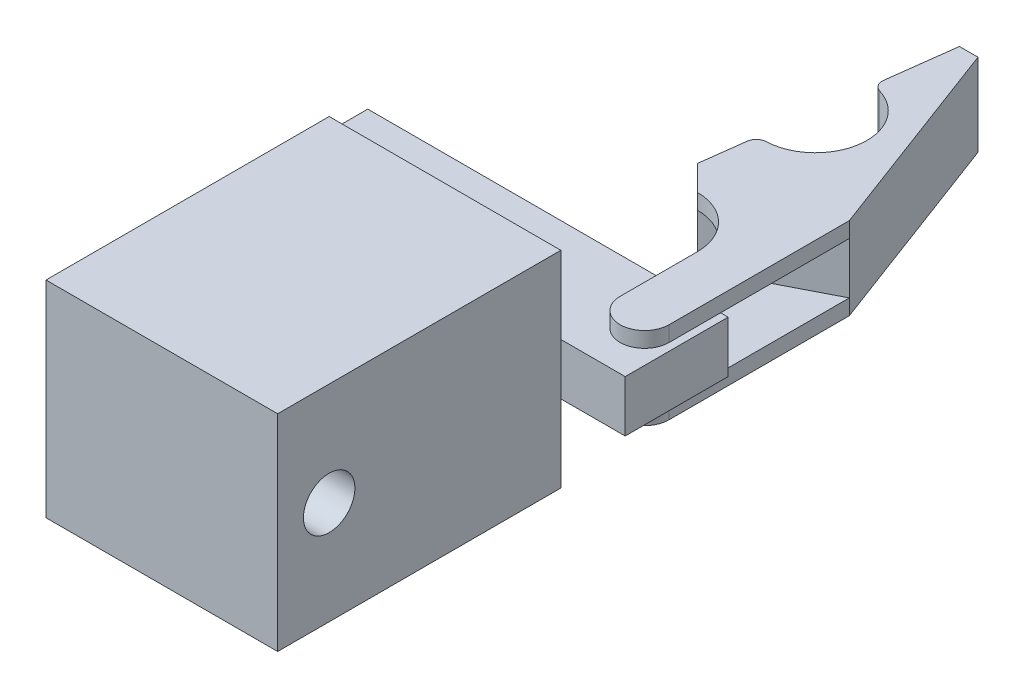
ISO-10303-21;
HEADER;
FILE_DESCRIPTION(('STEP AP214'),'2;1');
FILE_NAME('part.step','',(''),(''),'','','');
FILE_SCHEMA(('AUTOMOTIVE_DESIGN { 1 0 10303 214 1 1 1 1 }'));
ENDSEC;
DATA;
#1=APPLICATION_CONTEXT('core data for automotive mechanical design processes');
#2=APPLICATION_PROTOCOL_DEFINITION('international standard','automotive_design',2000,#1);
#3=PRODUCT_CONTEXT('',#1,'mechanical');
#4=PRODUCT('Part','Part','',(#3));
#5=PRODUCT_RELATED_PRODUCT_CATEGORY('part','',(#4));
#6=PRODUCT_DEFINITION_FORMATION('','',#4);
#7=PRODUCT_DEFINITION_CONTEXT('part definition',#1,'design');
#8=PRODUCT_DEFINITION('design','',#6,#7);
#9=PRODUCT_DEFINITION_SHAPE('','',#8);
#10=(LENGTH_UNIT() NAMED_UNIT(*) SI_UNIT(.MILLI.,.METRE.));
#11=(NAMED_UNIT(*) PLANE_ANGLE_UNIT() SI_UNIT($,.RADIAN.));
#12=(NAMED_UNIT(*) SI_UNIT($,.STERADIAN.) SOLID_ANGLE_UNIT());
#13=UNCERTAINTY_MEASURE_WITH_UNIT(LENGTH_MEASURE(1.E-05),#10,'distance_accuracy_value','');
#14=(GEOMETRIC_REPRESENTATION_CONTEXT(3) GLOBAL_UNCERTAINTY_ASSIGNED_CONTEXT((#13)) GLOBAL_UNIT_ASSIGNED_CONTEXT((#10,
#11,#12)) REPRESENTATION_CONTEXT('',''));
#15=CARTESIAN_POINT('',(0.,0.,0.));
#16=DIRECTION('',(0.,0.,1.));
#17=DIRECTION('',(1.,0.,0.));
#18=AXIS2_PLACEMENT_3D('',#15,#16,#17);
#19=CARTESIAN_POINT('',(15.2458291638118,25.,-99.1847945679448));
#20=DIRECTION('',(0.,1.,0.));
#21=DIRECTION('',(-1.,0.,0.));
#22=AXIS2_PLACEMENT_3D('',#19,#20,#21);
#23=PLANE('',#22);
#24=DIRECTION('',(-0.89005464278004,0.,0.455853850335495));
#25=VECTOR('',#24,1.);
#26=CARTESIAN_POINT('',(-22.4473482633456,25.,-43.8284474841817));
#27=LINE('',#26,#25);
#28=CARTESIAN_POINT('',(33.5338580237889,25.,-72.5));
#29=VERTEX_POINT('',#28);
#30=CARTESIAN_POINT('',(14.008858023789,25.,-62.4999999999999));
#31=VERTEX_POINT('',#30);
#32=EDGE_CURVE('E344',#29,#31,#27,.T.);
#33=ORIENTED_EDGE('',*,*,#32,.F.);
#34=DIRECTION('',(0.,0.,-1.));
#35=VECTOR('',#34,1.);
#36=CARTESIAN_POINT('',(33.5338580237892,25.,-37.5));
#37=LINE('',#36,#35);
#38=CARTESIAN_POINT('',(33.5338580237892,25.,-47.5));
#39=VERTEX_POINT('',#38);
#40=EDGE_CURVE('E406',#39,#29,#37,.T.);
#41=ORIENTED_EDGE('',*,*,#40,.F.);
#42=DIRECTION('',(-1.,0.,0.));
#43=VECTOR('',#42,1.);
#44=CARTESIAN_POINT('',(0.,25.,-47.5));
#45=LINE('',#44,#43);
#46=CARTESIAN_POINT('',(24.0088580237891,25.,-47.5));
#47=VERTEX_POINT('',#46);
#48=EDGE_CURVE('E451',#39,#47,#45,.T.);
#49=ORIENTED_EDGE('',*,*,#48,.T.);
#50=DIRECTION('',(0.,0.,1.));
#51=VECTOR('',#50,1.);
#52=CARTESIAN_POINT('',(24.0088580237891,25.,-52.5));
#53=LINE('',#52,#51);
#54=CARTESIAN_POINT('',(24.008858023789,25.,-52.5));
#55=VERTEX_POINT('',#54);
#56=EDGE_CURVE('E399',#55,#47,#53,.T.);
#57=ORIENTED_EDGE('',*,*,#56,.F.);
#58=CARTESIAN_POINT('',(14.008858023789,25.,-52.4999999999999));
#59=DIRECTION('',(0.,-1.,0.));
#60=DIRECTION('',(-1.,0.,0.));
#61=AXIS2_PLACEMENT_3D('',#58,#59,#60);
#62=CIRCLE('',#61,10.);
#63=EDGE_CURVE('E357',#31,#55,#62,.T.);
#64=ORIENTED_EDGE('',*,*,#63,.F.);
#65=EDGE_LOOP('',(#33,#41,#49,#57,#64));
#66=FACE_BOUND('',#65,.T.);
#67=ADVANCED_FACE('F42',(#66),#23,.F.);
#68=CARTESIAN_POINT('',(35.,25.,-47.5));
#69=DIRECTION('',(0.,-1.,0.));
#70=DIRECTION('',(1.,0.,0.));
#71=AXIS2_PLACEMENT_3D('',#68,#69,#70);
#72=PLANE('',#71);
#73=CARTESIAN_POINT('',(-27.7826566636179,25.,-37.5));
#74=DIRECTION('',(0.,1.,0.));
#75=DIRECTION('',(-1.,0.,0.));
#76=AXIS2_PLACEMENT_3D('',#73,#74,#75);
#77=CIRCLE('',#76,1.5);
#78=CARTESIAN_POINT('',(-29.2826566636179,25.,-37.5));
#79=VERTEX_POINT('',#78);
#80=EDGE_CURVE('E454',#79,#79,#77,.T.);
#81=ORIENTED_EDGE('',*,*,#80,.F.);
#82=EDGE_LOOP('',(#81));
#83=FACE_BOUND('',#82,.T.);
#84=CARTESIAN_POINT('',(24.0088580237892,25.,-37.5));
#85=VERTEX_POINT('',#84);
#86=EDGE_CURVE('E398',#47,#85,#53,.T.);
#87=ORIENTED_EDGE('',*,*,#86,.F.);
#88=DIRECTION('',(1.,0.,0.));
#89=VECTOR('',#88,1.);
#90=CARTESIAN_POINT('',(35.,25.,-47.5));
#91=LINE('',#90,#89);
#92=CARTESIAN_POINT('',(-35.,25.,-47.5));
#93=VERTEX_POINT('',#92);
#94=EDGE_CURVE('E468',#93,#47,#91,.T.);
#95=ORIENTED_EDGE('',*,*,#94,.F.);
#96=DIRECTION('',(0.,0.,1.));
#97=VECTOR('',#96,1.);
#98=CARTESIAN_POINT('',(-35.,25.,-47.5));
#99=LINE('',#98,#97);
#100=CARTESIAN_POINT('',(-35.,25.,-27.5));
#101=VERTEX_POINT('',#100);
#102=EDGE_CURVE('E505',#93,#101,#99,.T.);
#103=ORIENTED_EDGE('',*,*,#102,.T.);
#104=DIRECTION('',(1.,0.,0.));
#105=VECTOR('',#104,1.);
#106=CARTESIAN_POINT('',(35.,25.,-27.5));
#107=LINE('',#106,#105);
#108=CARTESIAN_POINT('',(-22.5,25.,-27.5));
#109=VERTEX_POINT('',#108);
#110=EDGE_CURVE('E485',#101,#109,#107,.T.);
#111=ORIENTED_EDGE('',*,*,#110,.T.);
#112=CARTESIAN_POINT('',(22.5,25.,-27.5));
#113=VERTEX_POINT('',#112);
#114=EDGE_CURVE('E53',#109,#113,#107,.T.);
#115=ORIENTED_EDGE('',*,*,#114,.T.);
#116=CARTESIAN_POINT('',(35.,25.,-27.5));
#117=VERTEX_POINT('',#116);
#118=EDGE_CURVE('E484',#113,#117,#107,.T.);
#119=ORIENTED_EDGE('',*,*,#118,.T.);
#120=DIRECTION('',(0.,0.,1.));
#121=VECTOR('',#120,1.);
#122=CARTESIAN_POINT('',(35.,25.,-47.5));
#123=LINE('',#122,#121);
#124=CARTESIAN_POINT('',(35.,25.,-47.5));
#125=VERTEX_POINT('',#124);
#126=EDGE_CURVE('E501',#125,#117,#123,.T.);
#127=ORIENTED_EDGE('',*,*,#126,.F.);
#128=EDGE_CURVE('E467',#39,#125,#91,.T.);
#129=ORIENTED_EDGE('',*,*,#128,.F.);
#130=CARTESIAN_POINT('',(33.5338580237892,25.,-37.5));
#131=VERTEX_POINT('',#130);
#132=EDGE_CURVE('E71',#131,#39,#37,.T.);
#133=ORIENTED_EDGE('',*,*,#132,.F.);
#134=CARTESIAN_POINT('',(28.7713580237892,25.,-37.5));
#135=DIRECTION('',(0.,1.,0.));
#136=DIRECTION('',(-1.,0.,0.));
#137=AXIS2_PLACEMENT_3D('',#134,#135,#136);
#138=CIRCLE('',#137,4.76250000000001);
#139=EDGE_CURVE('E403',#85,#131,#138,.T.);
#140=ORIENTED_EDGE('',*,*,#139,.F.);
#141=EDGE_LOOP('',(#87,#95,#103,#111,#115,#119,#127,#129,#133,#140));
#142=FACE_BOUND('',#141,.T.);
#143=ADVANCED_FACE('F598',(#83,#142),#72,.F.);
#144=CARTESIAN_POINT('',(-22.5,40.,-27.5));
#145=DIRECTION('',(0.,0.,1.));
#146=DIRECTION('',(1.,0.,0.));
#147=AXIS2_PLACEMENT_3D('',#144,#145,#146);
#148=PLANE('',#147);
#149=DIRECTION('',(-1.,0.,0.));
#150=VECTOR('',#149,1.);
#151=CARTESIAN_POINT('',(35.,15.,-27.5));
#152=LINE('',#151,#150);
#153=CARTESIAN_POINT('',(22.5,15.,-27.5));
#154=VERTEX_POINT('',#153);
#155=CARTESIAN_POINT('',(-22.5,15.,-27.5));
#156=VERTEX_POINT('',#155);
#157=EDGE_CURVE('E11',#154,#156,#152,.T.);
#158=ORIENTED_EDGE('',*,*,#157,.F.);
#159=DIRECTION('',(0.,-1.,0.));
#160=VECTOR('',#159,1.);
#161=CARTESIAN_POINT('',(22.5,40.,-27.5));
#162=LINE('',#161,#160);
#163=CARTESIAN_POINT('',(22.5,0.,-27.5));
#164=VERTEX_POINT('',#163);
#165=EDGE_CURVE('E555',#154,#164,#162,.T.);
#166=ORIENTED_EDGE('',*,*,#165,.T.);
#167=DIRECTION('',(-1.,0.,0.));
#168=VECTOR('',#167,1.);
#169=CARTESIAN_POINT('',(-22.5,0.,-27.5));
#170=LINE('',#169,#168);
#171=CARTESIAN_POINT('',(-22.5,0.,-27.5));
#172=VERTEX_POINT('',#171);
#173=EDGE_CURVE('E536',#164,#172,#170,.T.);
#174=ORIENTED_EDGE('',*,*,#173,.T.);
#175=DIRECTION('',(0.,-1.,0.));
#176=VECTOR('',#175,1.);
#177=CARTESIAN_POINT('',(-22.5,40.,-27.5));
#178=LINE('',#177,#176);
#179=EDGE_CURVE('E551',#156,#172,#178,.T.);
#180=ORIENTED_EDGE('',*,*,#179,.F.);
#181=EDGE_LOOP('',(#158,#166,#174,#180));
#182=FACE_BOUND('',#181,.T.);
#183=ADVANCED_FACE('F572',(#182),#148,.F.);
#184=ORIENTED_EDGE('',*,*,#114,.F.);
#185=CARTESIAN_POINT('',(-22.5,40.,-27.5));
#186=VERTEX_POINT('',#185);
#187=EDGE_CURVE('E552',#186,#109,#178,.T.);
#188=ORIENTED_EDGE('',*,*,#187,.F.);
#189=DIRECTION('',(-1.,0.,0.));
#190=VECTOR('',#189,1.);
#191=CARTESIAN_POINT('',(-22.5,40.,-27.5));
#192=LINE('',#191,#190);
#193=CARTESIAN_POINT('',(22.5,40.,-27.5));
#194=VERTEX_POINT('',#193);
#195=EDGE_CURVE('E522',#194,#186,#192,.T.);
#196=ORIENTED_EDGE('',*,*,#195,.F.);
#197=EDGE_CURVE('E46',#194,#113,#162,.T.);
#198=ORIENTED_EDGE('',*,*,#197,.T.);
#199=EDGE_LOOP('',(#184,#188,#196,#198));
#200=FACE_BOUND('',#199,.T.);
#201=ADVANCED_FACE('F589',(#200),#148,.F.);
#202=CARTESIAN_POINT('',(22.5,40.,27.5));
#203=DIRECTION('',(-1.,0.,0.));
#204=DIRECTION('',(0.,0.,1.));
#205=AXIS2_PLACEMENT_3D('',#202,#203,#204);
#206=PLANE('',#205);
#207=CARTESIAN_POINT('',(22.5,20.,17.5));
#208=DIRECTION('',(1.,0.,0.));
#209=DIRECTION('',(0.,0.,-1.));
#210=AXIS2_PLACEMENT_3D('',#207,#208,#209);
#211=CIRCLE('',#210,5.);
#212=CARTESIAN_POINT('',(22.5,20.,12.5));
#213=VERTEX_POINT('',#212);
#214=EDGE_CURVE('E509',#213,#213,#211,.T.);
#215=ORIENTED_EDGE('',*,*,#214,.F.);
#216=EDGE_LOOP('',(#215));
#217=FACE_BOUND('',#216,.T.);
#218=DIRECTION('',(0.,0.,-1.));
#219=VECTOR('',#218,1.);
#220=CARTESIAN_POINT('',(22.5,0.,27.5));
#221=LINE('',#220,#219);
#222=CARTESIAN_POINT('',(22.5,0.,27.5));
#223=VERTEX_POINT('',#222);
#224=EDGE_CURVE('E517',#223,#164,#221,.T.);
#225=ORIENTED_EDGE('',*,*,#224,.T.);
#226=ORIENTED_EDGE('',*,*,#165,.F.);
#227=EDGE_CURVE('E564',#113,#154,#162,.T.);
#228=ORIENTED_EDGE('',*,*,#227,.F.);
#229=ORIENTED_EDGE('',*,*,#197,.F.);
#230=DIRECTION('',(0.,0.,-1.));
#231=VECTOR('',#230,1.);
#232=CARTESIAN_POINT('',(22.5,40.,27.5));
#233=LINE('',#232,#231);
#234=CARTESIAN_POINT('',(22.5,40.,27.5));
#235=VERTEX_POINT('',#234);
#236=EDGE_CURVE('E518',#235,#194,#233,.T.);
#237=ORIENTED_EDGE('',*,*,#236,.F.);
#238=DIRECTION('',(0.,-1.,0.));
#239=VECTOR('',#238,1.);
#240=CARTESIAN_POINT('',(22.5,40.,27.5));
#241=LINE('',#240,#239);
#242=EDGE_CURVE('E532',#235,#223,#241,.T.);
#243=ORIENTED_EDGE('',*,*,#242,.T.);
#244=EDGE_LOOP('',(#225,#226,#228,#229,#237,#243));
#245=FACE_BOUND('',#244,.T.);
#246=ADVANCED_FACE('F44',(#217,#245),#206,.F.);
#247=CARTESIAN_POINT('',(-22.5,40.,27.5));
#248=DIRECTION('',(1.,0.,0.));
#249=DIRECTION('',(0.,0.,-1.));
#250=AXIS2_PLACEMENT_3D('',#247,#248,#249);
#251=PLANE('',#250);
#252=CARTESIAN_POINT('',(-22.5,20.,17.5));
#253=DIRECTION('',(1.,0.,0.));
#254=DIRECTION('',(0.,0.,-1.));
#255=AXIS2_PLACEMENT_3D('',#252,#253,#254);
#256=CIRCLE('',#255,5.);
#257=CARTESIAN_POINT('',(-22.5,20.,12.5));
#258=VERTEX_POINT('',#257);
#259=EDGE_CURVE('E513',#258,#258,#256,.F.);
#260=ORIENTED_EDGE('',*,*,#259,.F.);
#261=EDGE_LOOP('',(#260));
#262=FACE_BOUND('',#261,.T.);
#263=DIRECTION('',(0.,0.,1.));
#264=VECTOR('',#263,1.);
#265=CARTESIAN_POINT('',(-22.5,0.,27.5));
#266=LINE('',#265,#264);
#267=CARTESIAN_POINT('',(-22.5,0.,27.5));
#268=VERTEX_POINT('',#267);
#269=EDGE_CURVE('E540',#172,#268,#266,.T.);
#270=ORIENTED_EDGE('',*,*,#269,.T.);
#271=DIRECTION('',(0.,-1.,0.));
#272=VECTOR('',#271,1.);
#273=CARTESIAN_POINT('',(-22.5,40.,27.5));
#274=LINE('',#273,#272);
#275=CARTESIAN_POINT('',(-22.5,40.,27.5));
#276=VERTEX_POINT('',#275);
#277=EDGE_CURVE('E548',#276,#268,#274,.T.);
#278=ORIENTED_EDGE('',*,*,#277,.F.);
#279=DIRECTION('',(0.,0.,1.));
#280=VECTOR('',#279,1.);
#281=CARTESIAN_POINT('',(-22.5,40.,27.5));
#282=LINE('',#281,#280);
#283=EDGE_CURVE('E526',#186,#276,#282,.T.);
#284=ORIENTED_EDGE('',*,*,#283,.F.);
#285=ORIENTED_EDGE('',*,*,#187,.T.);
#286=EDGE_CURVE('E556',#109,#156,#178,.T.);
#287=ORIENTED_EDGE('',*,*,#286,.T.);
#288=ORIENTED_EDGE('',*,*,#179,.T.);
#289=EDGE_LOOP('',(#270,#278,#284,#285,#287,#288));
#290=FACE_BOUND('',#289,.T.);
#291=ADVANCED_FACE('F566',(#262,#290),#251,.F.);
#292=CARTESIAN_POINT('',(-22.5,40.,27.5));
#293=DIRECTION('',(0.,0.,-1.));
#294=DIRECTION('',(-1.,0.,0.));
#295=AXIS2_PLACEMENT_3D('',#292,#293,#294);
#296=PLANE('',#295);
#297=DIRECTION('',(1.,0.,0.));
#298=VECTOR('',#297,1.);
#299=CARTESIAN_POINT('',(-22.5,0.,27.5));
#300=LINE('',#299,#298);
#301=EDGE_CURVE('E523',#268,#223,#300,.T.);
#302=ORIENTED_EDGE('',*,*,#301,.T.);
#303=ORIENTED_EDGE('',*,*,#242,.F.);
#304=DIRECTION('',(1.,0.,0.));
#305=VECTOR('',#304,1.);
#306=CARTESIAN_POINT('',(-22.5,40.,27.5));
#307=LINE('',#306,#305);
#308=EDGE_CURVE('E529',#276,#235,#307,.T.);
#309=ORIENTED_EDGE('',*,*,#308,.F.);
#310=ORIENTED_EDGE('',*,*,#277,.T.);
#311=EDGE_LOOP('',(#302,#303,#309,#310));
#312=FACE_BOUND('',#311,.T.);
#313=ADVANCED_FACE('F580',(#312),#296,.F.);
#314=CARTESIAN_POINT('',(0.,40.,0.));
#315=DIRECTION('',(0.,-1.,0.));
#316=DIRECTION('',(0.,0.,-1.));
#317=AXIS2_PLACEMENT_3D('',#314,#315,#316);
#318=PLANE('',#317);
#319=ORIENTED_EDGE('',*,*,#236,.T.);
#320=ORIENTED_EDGE('',*,*,#195,.T.);
#321=ORIENTED_EDGE('',*,*,#283,.T.);
#322=ORIENTED_EDGE('',*,*,#308,.T.);
#323=EDGE_LOOP('',(#319,#320,#321,#322));
#324=FACE_BOUND('',#323,.T.);
#325=ADVANCED_FACE('F587',(#324),#318,.F.);
#326=CARTESIAN_POINT('',(0.,0.,0.));
#327=DIRECTION('',(0.,-1.,0.));
#328=DIRECTION('',(0.,0.,-1.));
#329=AXIS2_PLACEMENT_3D('',#326,#327,#328);
#330=PLANE('',#329);
#331=ORIENTED_EDGE('',*,*,#224,.F.);
#332=ORIENTED_EDGE('',*,*,#301,.F.);
#333=ORIENTED_EDGE('',*,*,#269,.F.);
#334=ORIENTED_EDGE('',*,*,#173,.F.);
#335=EDGE_LOOP('',(#331,#332,#333,#334));
#336=FACE_BOUND('',#335,.T.);
#337=ADVANCED_FACE('F577',(#336),#330,.T.);
#338=CARTESIAN_POINT('',(-36.642135623731,20.,17.5));
#339=DIRECTION('',(1.,0.,0.));
#340=DIRECTION('',(0.,0.,-1.));
#341=AXIS2_PLACEMENT_3D('',#338,#339,#340);
#342=CYLINDRICAL_SURFACE('',#341,5.);
#343=ORIENTED_EDGE('',*,*,#259,.T.);
#344=EDGE_LOOP('',(#343));
#345=FACE_BOUND('',#344,.T.);
#346=ORIENTED_EDGE('',*,*,#214,.T.);
#347=EDGE_LOOP('',(#346));
#348=FACE_BOUND('',#347,.T.);
#349=ADVANCED_FACE('F707',(#345,#348),#342,.F.);
#350=CARTESIAN_POINT('',(0.,0.,-27.5));
#351=DIRECTION('',(0.,0.,1.));
#352=DIRECTION('',(1.,0.,0.));
#353=AXIS2_PLACEMENT_3D('',#350,#351,#352);
#354=PLANE('',#353);
#355=ORIENTED_EDGE('',*,*,#286,.F.);
#356=ORIENTED_EDGE('',*,*,#110,.F.);
#357=DIRECTION('',(0.,1.,0.));
#358=VECTOR('',#357,1.);
#359=CARTESIAN_POINT('',(-35.,15.,-27.5));
#360=LINE('',#359,#358);
#361=CARTESIAN_POINT('',(-35.,15.,-27.5));
#362=VERTEX_POINT('',#361);
#363=EDGE_CURVE('E462',#362,#101,#360,.T.);
#364=ORIENTED_EDGE('',*,*,#363,.F.);
#365=EDGE_CURVE('E56',#156,#362,#152,.T.);
#366=ORIENTED_EDGE('',*,*,#365,.F.);
#367=EDGE_LOOP('',(#355,#356,#364,#366));
#368=FACE_BOUND('',#367,.T.);
#369=ADVANCED_FACE('F626',(#368),#354,.T.);
#370=CARTESIAN_POINT('',(-35.,15.,-47.5));
#371=DIRECTION('',(1.,0.,0.));
#372=DIRECTION('',(0.,0.,-1.));
#373=AXIS2_PLACEMENT_3D('',#370,#371,#372);
#374=PLANE('',#373);
#375=ORIENTED_EDGE('',*,*,#363,.T.);
#376=ORIENTED_EDGE('',*,*,#102,.F.);
#377=DIRECTION('',(0.,1.,0.));
#378=VECTOR('',#377,1.);
#379=CARTESIAN_POINT('',(-35.,15.,-47.5));
#380=LINE('',#379,#378);
#381=CARTESIAN_POINT('',(-35.,15.,-47.5));
#382=VERTEX_POINT('',#381);
#383=EDGE_CURVE('E463',#382,#93,#380,.T.);
#384=ORIENTED_EDGE('',*,*,#383,.F.);
#385=DIRECTION('',(0.,0.,1.));
#386=VECTOR('',#385,1.);
#387=CARTESIAN_POINT('',(-35.,15.,-47.5));
#388=LINE('',#387,#386);
#389=EDGE_CURVE('E480',#382,#362,#388,.T.);
#390=ORIENTED_EDGE('',*,*,#389,.T.);
#391=EDGE_LOOP('',(#375,#376,#384,#390));
#392=FACE_BOUND('',#391,.T.);
#393=ADVANCED_FACE('F624',(#392),#374,.F.);
#394=CARTESIAN_POINT('',(35.,15.,-47.5));
#395=DIRECTION('',(-1.,0.,0.));
#396=DIRECTION('',(0.,0.,1.));
#397=AXIS2_PLACEMENT_3D('',#394,#395,#396);
#398=PLANE('',#397);
#399=DIRECTION('',(0.,-1.,0.));
#400=VECTOR('',#399,1.);
#401=CARTESIAN_POINT('',(35.,15.,-27.5));
#402=LINE('',#401,#400);
#403=CARTESIAN_POINT('',(35.,15.,-27.5));
#404=VERTEX_POINT('',#403);
#405=EDGE_CURVE('E489',#117,#404,#402,.T.);
#406=ORIENTED_EDGE('',*,*,#405,.T.);
#407=DIRECTION('',(0.,0.,1.));
#408=VECTOR('',#407,1.);
#409=CARTESIAN_POINT('',(35.,15.,-47.5));
#410=LINE('',#409,#408);
#411=CARTESIAN_POINT('',(35.,15.,-47.5));
#412=VERTEX_POINT('',#411);
#413=EDGE_CURVE('E497',#412,#404,#410,.T.);
#414=ORIENTED_EDGE('',*,*,#413,.F.);
#415=DIRECTION('',(0.,-1.,0.));
#416=VECTOR('',#415,1.);
#417=CARTESIAN_POINT('',(35.,15.,-47.5));
#418=LINE('',#417,#416);
#419=EDGE_CURVE('E472',#125,#412,#418,.T.);
#420=ORIENTED_EDGE('',*,*,#419,.F.);
#421=ORIENTED_EDGE('',*,*,#126,.T.);
#422=EDGE_LOOP('',(#406,#414,#420,#421));
#423=FACE_BOUND('',#422,.T.);
#424=ADVANCED_FACE('F605',(#423),#398,.F.);
#425=CARTESIAN_POINT('',(35.,15.,-47.5));
#426=DIRECTION('',(0.,1.,0.));
#427=DIRECTION('',(-1.,0.,0.));
#428=AXIS2_PLACEMENT_3D('',#425,#426,#427);
#429=PLANE('',#428);
#430=CARTESIAN_POINT('',(-27.7826566636179,15.,-37.5));
#431=DIRECTION('',(0.,1.,0.));
#432=DIRECTION('',(-1.,0.,0.));
#433=AXIS2_PLACEMENT_3D('',#430,#431,#432);
#434=CIRCLE('',#433,1.5);
#435=CARTESIAN_POINT('',(-29.2826566636179,15.,-37.5));
#436=VERTEX_POINT('',#435);
#437=EDGE_CURVE('E458',#436,#436,#434,.F.);
#438=ORIENTED_EDGE('',*,*,#437,.F.);
#439=EDGE_LOOP('',(#438));
#440=FACE_BOUND('',#439,.T.);
#441=CARTESIAN_POINT('',(28.7713580237892,15.,-37.5));
#442=DIRECTION('',(0.,1.,0.));
#443=DIRECTION('',(-1.,0.,0.));
#444=AXIS2_PLACEMENT_3D('',#441,#442,#443);
#445=CIRCLE('',#444,4.76250000000001);
#446=CARTESIAN_POINT('',(24.0088580237892,15.,-37.5));
#447=VERTEX_POINT('',#446);
#448=CARTESIAN_POINT('',(33.5338580237892,15.,-37.5));
#449=VERTEX_POINT('',#448);
#450=EDGE_CURVE('E317',#447,#449,#445,.T.);
#451=ORIENTED_EDGE('',*,*,#450,.T.);
#452=DIRECTION('',(0.,0.,-1.));
#453=VECTOR('',#452,1.);
#454=CARTESIAN_POINT('',(33.5338580237892,15.,-37.5));
#455=LINE('',#454,#453);
#456=CARTESIAN_POINT('',(33.5338580237891,15.,-47.5));
#457=VERTEX_POINT('',#456);
#458=EDGE_CURVE('E313',#449,#457,#455,.T.);
#459=ORIENTED_EDGE('',*,*,#458,.T.);
#460=DIRECTION('',(-1.,0.,0.));
#461=VECTOR('',#460,1.);
#462=CARTESIAN_POINT('',(35.,15.,-47.5));
#463=LINE('',#462,#461);
#464=EDGE_CURVE('E476',#412,#457,#463,.T.);
#465=ORIENTED_EDGE('',*,*,#464,.F.);
#466=ORIENTED_EDGE('',*,*,#413,.T.);
#467=EDGE_CURVE('E55',#404,#154,#152,.T.);
#468=ORIENTED_EDGE('',*,*,#467,.T.);
#469=ORIENTED_EDGE('',*,*,#157,.T.);
#470=ORIENTED_EDGE('',*,*,#365,.T.);
#471=ORIENTED_EDGE('',*,*,#389,.F.);
#472=CARTESIAN_POINT('',(24.0088580237891,15.,-47.5));
#473=VERTEX_POINT('',#472);
#474=EDGE_CURVE('E475',#473,#382,#463,.T.);
#475=ORIENTED_EDGE('',*,*,#474,.F.);
#476=DIRECTION('',(0.,0.,1.));
#477=VECTOR('',#476,1.);
#478=CARTESIAN_POINT('',(24.0088580237891,15.,-52.5));
#479=LINE('',#478,#477);
#480=EDGE_CURVE('E322',#473,#447,#479,.T.);
#481=ORIENTED_EDGE('',*,*,#480,.T.);
#482=EDGE_LOOP('',(#451,#459,#465,#466,#468,#469,#470,#471,#475,#481));
#483=FACE_BOUND('',#482,.T.);
#484=ADVANCED_FACE('F610',(#440,#483),#429,.F.);
#485=CARTESIAN_POINT('',(0.,0.,-47.5));
#486=DIRECTION('',(0.,0.,1.));
#487=DIRECTION('',(1.,0.,0.));
#488=AXIS2_PLACEMENT_3D('',#485,#486,#487);
#489=PLANE('',#488);
#490=ORIENTED_EDGE('',*,*,#383,.T.);
#491=ORIENTED_EDGE('',*,*,#94,.T.);
#492=ORIENTED_EDGE('',*,*,#48,.F.);
#493=ORIENTED_EDGE('',*,*,#128,.T.);
#494=ORIENTED_EDGE('',*,*,#419,.T.);
#495=ORIENTED_EDGE('',*,*,#464,.T.);
#496=DIRECTION('',(1.,0.,0.));
#497=VECTOR('',#496,1.);
#498=CARTESIAN_POINT('',(0.,15.,-47.5));
#499=LINE('',#498,#497);
#500=EDGE_CURVE('E341',#473,#457,#499,.T.);
#501=ORIENTED_EDGE('',*,*,#500,.F.);
#502=ORIENTED_EDGE('',*,*,#474,.T.);
#503=EDGE_LOOP('',(#490,#491,#492,#493,#494,#495,#501,#502));
#504=FACE_BOUND('',#503,.T.);
#505=ADVANCED_FACE('F614',(#504),#489,.F.);
#506=ORIENTED_EDGE('',*,*,#118,.F.);
#507=ORIENTED_EDGE('',*,*,#227,.T.);
#508=ORIENTED_EDGE('',*,*,#467,.F.);
#509=ORIENTED_EDGE('',*,*,#405,.F.);
#510=EDGE_LOOP('',(#506,#507,#508,#509));
#511=FACE_BOUND('',#510,.T.);
#512=ADVANCED_FACE('F608',(#511),#354,.T.);
#513=CARTESIAN_POINT('',(-27.7826566636179,10.7573593128807,-37.5));
#514=DIRECTION('',(0.,1.,0.));
#515=DIRECTION('',(-1.,0.,0.));
#516=AXIS2_PLACEMENT_3D('',#513,#514,#515);
#517=CYLINDRICAL_SURFACE('',#516,1.5);
#518=ORIENTED_EDGE('',*,*,#437,.T.);
#519=EDGE_LOOP('',(#518));
#520=FACE_BOUND('',#519,.T.);
#521=ORIENTED_EDGE('',*,*,#80,.T.);
#522=EDGE_LOOP('',(#521));
#523=FACE_BOUND('',#522,.T.);
#524=ADVANCED_FACE('F693',(#520,#523),#517,.F.);
#525=CARTESIAN_POINT('',(33.5338580237889,28.,-72.5));
#526=DIRECTION('',(-0.936329177569042,0.,0.351123441588398));
#527=DIRECTION('',(0.351123441588398,0.,0.936329177569042));
#528=AXIS2_PLACEMENT_3D('',#525,#526,#527);
#529=PLANE('',#528);
#530=DIRECTION('',(0.,-1.,0.));
#531=VECTOR('',#530,1.);
#532=CARTESIAN_POINT('',(33.5338580237889,28.,-72.5));
#533=LINE('',#532,#531);
#534=CARTESIAN_POINT('',(33.5338580237889,28.,-72.5));
#535=VERTEX_POINT('',#534);
#536=EDGE_CURVE('E395',#535,#29,#533,.T.);
#537=ORIENTED_EDGE('',*,*,#536,.T.);
#538=DIRECTION('',(0.,1.,0.));
#539=VECTOR('',#538,1.);
#540=CARTESIAN_POINT('',(33.5338580237889,15.,-72.5));
#541=LINE('',#540,#539);
#542=CARTESIAN_POINT('',(33.5338580237889,15.,-72.5));
#543=VERTEX_POINT('',#542);
#544=EDGE_CURVE('E250',#543,#29,#541,.T.);
#545=ORIENTED_EDGE('',*,*,#544,.F.);
#546=DIRECTION('',(0.,1.,0.));
#547=VECTOR('',#546,1.);
#548=CARTESIAN_POINT('',(33.5338580237889,12.,-72.5));
#549=LINE('',#548,#547);
#550=CARTESIAN_POINT('',(33.5338580237889,12.,-72.5));
#551=VERTEX_POINT('',#550);
#552=EDGE_CURVE('E243',#551,#543,#549,.T.);
#553=ORIENTED_EDGE('',*,*,#552,.F.);
#554=DIRECTION('',(-0.351123441588398,0.,-0.936329177569042));
#555=VECTOR('',#554,1.);
#556=CARTESIAN_POINT('',(33.5338580237889,12.,-72.5));
#557=LINE('',#556,#555);
#558=CARTESIAN_POINT('',(18.5338580237886,12.,-112.5));
#559=VERTEX_POINT('',#558);
#560=EDGE_CURVE('E248',#551,#559,#557,.T.);
#561=ORIENTED_EDGE('',*,*,#560,.T.);
#562=DIRECTION('',(0.,-1.,0.));
#563=VECTOR('',#562,1.);
#564=CARTESIAN_POINT('',(18.5338580237886,28.,-112.5));
#565=LINE('',#564,#563);
#566=CARTESIAN_POINT('',(18.5338580237886,28.,-112.5));
#567=VERTEX_POINT('',#566);
#568=EDGE_CURVE('E444',#567,#559,#565,.T.);
#569=ORIENTED_EDGE('',*,*,#568,.F.);
#570=DIRECTION('',(-0.351123441588398,0.,-0.936329177569042));
#571=VECTOR('',#570,1.);
#572=CARTESIAN_POINT('',(33.5338580237889,28.,-72.5));
#573=LINE('',#572,#571);
#574=EDGE_CURVE('E358',#535,#567,#573,.T.);
#575=ORIENTED_EDGE('',*,*,#574,.F.);
#576=EDGE_LOOP('',(#537,#545,#553,#561,#569,#575));
#577=FACE_BOUND('',#576,.T.);
#578=ADVANCED_FACE('F246',(#577),#529,.F.);
#579=CARTESIAN_POINT('',(18.5338580237886,28.,-112.5));
#580=DIRECTION('',(0.,0.,1.));
#581=DIRECTION('',(1.,0.,0.));
#582=AXIS2_PLACEMENT_3D('',#579,#580,#581);
#583=PLANE('',#582);
#584=ORIENTED_EDGE('',*,*,#568,.T.);
#585=DIRECTION('',(-1.,0.,0.));
#586=VECTOR('',#585,1.);
#587=CARTESIAN_POINT('',(18.5338580237886,12.,-112.5));
#588=LINE('',#587,#586);
#589=CARTESIAN_POINT('',(14.9338580237886,12.,-112.5));
#590=VERTEX_POINT('',#589);
#591=EDGE_CURVE('E266',#559,#590,#588,.T.);
#592=ORIENTED_EDGE('',*,*,#591,.T.);
#593=DIRECTION('',(0.,-1.,0.));
#594=VECTOR('',#593,1.);
#595=CARTESIAN_POINT('',(14.9338580237886,28.,-112.5));
#596=LINE('',#595,#594);
#597=CARTESIAN_POINT('',(14.9338580237886,28.,-112.5));
#598=VERTEX_POINT('',#597);
#599=EDGE_CURVE('E441',#598,#590,#596,.T.);
#600=ORIENTED_EDGE('',*,*,#599,.F.);
#601=DIRECTION('',(-1.,0.,0.));
#602=VECTOR('',#601,1.);
#603=CARTESIAN_POINT('',(18.5338580237886,28.,-112.5));
#604=LINE('',#603,#602);
#605=EDGE_CURVE('E362',#567,#598,#604,.T.);
#606=ORIENTED_EDGE('',*,*,#605,.F.);
#607=EDGE_LOOP('',(#584,#592,#600,#606));
#608=FACE_BOUND('',#607,.T.);
#609=ADVANCED_FACE('F879',(#608),#583,.F.);
#610=CARTESIAN_POINT('',(14.9338580237886,28.,-112.5));
#611=DIRECTION('',(0.991907308323476,0.,0.126964135465398));
#612=DIRECTION('',(0.126964135465398,0.,-0.991907308323477));
#613=AXIS2_PLACEMENT_3D('',#610,#611,#612);
#614=PLANE('',#613);
#615=ORIENTED_EDGE('',*,*,#599,.T.);
#616=DIRECTION('',(-0.126964135465398,0.,0.991907308323477));
#617=VECTOR('',#616,1.);
#618=CARTESIAN_POINT('',(14.9338580237886,12.,-112.5));
#619=LINE('',#618,#617);
#620=CARTESIAN_POINT('',(13.2620145471648,12.,-99.4387228388756));
#621=VERTEX_POINT('',#620);
#622=EDGE_CURVE('E306',#590,#621,#619,.T.);
#623=ORIENTED_EDGE('',*,*,#622,.T.);
#624=DIRECTION('',(0.,-1.,0.));
#625=VECTOR('',#624,1.);
#626=CARTESIAN_POINT('',(13.2620145471648,28.,-99.4387228388756));
#627=LINE('',#626,#625);
#628=CARTESIAN_POINT('',(13.2620145471648,28.,-99.4387228388756));
#629=VERTEX_POINT('',#628);
#630=EDGE_CURVE('E438',#629,#621,#627,.T.);
#631=ORIENTED_EDGE('',*,*,#630,.F.);
#632=DIRECTION('',(-0.126964135465398,0.,0.991907308323477));
#633=VECTOR('',#632,1.);
#634=CARTESIAN_POINT('',(14.9338580237886,28.,-112.5));
#635=LINE('',#634,#633);
#636=EDGE_CURVE('E365',#598,#629,#635,.T.);
#637=ORIENTED_EDGE('',*,*,#636,.F.);
#638=EDGE_LOOP('',(#615,#623,#631,#637));
#639=FACE_BOUND('',#638,.T.);
#640=ADVANCED_FACE('F876',(#639),#614,.F.);
#641=CARTESIAN_POINT('',(15.2458291638118,28.,-99.1847945679448));
#642=DIRECTION('',(0.,-1.,0.));
#643=DIRECTION('',(1.,0.,0.));
#644=AXIS2_PLACEMENT_3D('',#641,#642,#643);
#645=CYLINDRICAL_SURFACE('',#644,2.00000000000001);
#646=ORIENTED_EDGE('',*,*,#630,.T.);
#647=CARTESIAN_POINT('',(15.2458291638118,12.,-99.1847945679448));
#648=DIRECTION('',(0.,1.,0.));
#649=DIRECTION('',(-1.,0.,0.));
#650=AXIS2_PLACEMENT_3D('',#647,#648,#649);
#651=CIRCLE('',#650,2.00000000000001);
#652=CARTESIAN_POINT('',(14.6648167427021,12.,-97.2710483552728));
#653=VERTEX_POINT('',#652);
#654=EDGE_CURVE('E302',#621,#653,#651,.T.);
#655=ORIENTED_EDGE('',*,*,#654,.T.);
#656=DIRECTION('',(0.,-1.,0.));
#657=VECTOR('',#656,1.);
#658=CARTESIAN_POINT('',(14.6648167427021,28.,-97.2710483552728));
#659=LINE('',#658,#657);
#660=CARTESIAN_POINT('',(14.6648167427021,28.,-97.2710483552728));
#661=VERTEX_POINT('',#660);
#662=EDGE_CURVE('E435',#661,#653,#659,.T.);
#663=ORIENTED_EDGE('',*,*,#662,.F.);
#664=CARTESIAN_POINT('',(15.2458291638118,28.,-99.1847945679448));
#665=DIRECTION('',(0.,1.,0.));
#666=DIRECTION('',(-1.,0.,0.));
#667=AXIS2_PLACEMENT_3D('',#664,#665,#666);
#668=CIRCLE('',#667,2.00000000000001);
#669=EDGE_CURVE('E368',#629,#661,#668,.T.);
#670=ORIENTED_EDGE('',*,*,#669,.F.);
#671=EDGE_LOOP('',(#646,#655,#663,#670));
#672=FACE_BOUND('',#671,.T.);
#673=ADVANCED_FACE('F872',(#672),#645,.T.);
#674=CARTESIAN_POINT('',(11.7597546371536,28.,-87.702317291913));
#675=DIRECTION('',(0.,-1.,0.));
#676=DIRECTION('',(1.,0.,0.));
#677=AXIS2_PLACEMENT_3D('',#674,#675,#676);
#678=CYLINDRICAL_SURFACE('',#677,10.);
#679=ORIENTED_EDGE('',*,*,#662,.T.);
#680=CARTESIAN_POINT('',(11.7597546371536,12.,-87.702317291913));
#681=DIRECTION('',(0.,-1.,0.));
#682=DIRECTION('',(-1.,0.,0.));
#683=AXIS2_PLACEMENT_3D('',#680,#681,#682);
#684=CIRCLE('',#683,10.);
#685=CARTESIAN_POINT('',(12.1610502260169,12.,-77.7103724436686));
#686=VERTEX_POINT('',#685);
#687=EDGE_CURVE('E298',#653,#686,#684,.T.);
#688=ORIENTED_EDGE('',*,*,#687,.T.);
#689=DIRECTION('',(0.,-1.,0.));
#690=VECTOR('',#689,1.);
#691=CARTESIAN_POINT('',(12.1610502260169,28.,-77.7103724436686));
#692=LINE('',#691,#690);
#693=CARTESIAN_POINT('',(12.1610502260169,28.,-77.7103724436686));
#694=VERTEX_POINT('',#693);
#695=EDGE_CURVE('E432',#694,#686,#692,.T.);
#696=ORIENTED_EDGE('',*,*,#695,.F.);
#697=CARTESIAN_POINT('',(11.7597546371536,28.,-87.702317291913));
#698=DIRECTION('',(0.,-1.,0.));
#699=DIRECTION('',(-1.,0.,0.));
#700=AXIS2_PLACEMENT_3D('',#697,#698,#699);
#701=CIRCLE('',#700,10.);
#702=EDGE_CURVE('E371',#661,#694,#701,.T.);
#703=ORIENTED_EDGE('',*,*,#702,.F.);
#704=EDGE_LOOP('',(#679,#688,#696,#703));
#705=FACE_BOUND('',#704,.T.);
#706=ADVANCED_FACE('F868',(#705),#678,.F.);
#707=CARTESIAN_POINT('',(12.2413093437895,28.,-75.7119834740197));
#708=DIRECTION('',(0.,-1.,0.));
#709=DIRECTION('',(1.,0.,0.));
#710=AXIS2_PLACEMENT_3D('',#707,#708,#709);
#711=CYLINDRICAL_SURFACE('',#710,1.99999999999998);
#712=ORIENTED_EDGE('',*,*,#695,.T.);
#713=CARTESIAN_POINT('',(12.2413093437895,12.,-75.7119834740197));
#714=DIRECTION('',(0.,1.,0.));
#715=DIRECTION('',(-1.,0.,0.));
#716=AXIS2_PLACEMENT_3D('',#713,#714,#715);
#717=CIRCLE('',#716,1.99999999999998);
#718=CARTESIAN_POINT('',(10.2574947271426,12.,-75.9659117449505));
#719=VERTEX_POINT('',#718);
#720=EDGE_CURVE('E294',#686,#719,#717,.T.);
#721=ORIENTED_EDGE('',*,*,#720,.T.);
#722=DIRECTION('',(0.,-1.,0.));
#723=VECTOR('',#722,1.);
#724=CARTESIAN_POINT('',(10.2574947271426,28.,-75.9659117449505));
#725=LINE('',#724,#723);
#726=CARTESIAN_POINT('',(10.2574947271426,28.,-75.9659117449505));
#727=VERTEX_POINT('',#726);
#728=EDGE_CURVE('E429',#727,#719,#725,.T.);
#729=ORIENTED_EDGE('',*,*,#728,.F.);
#730=CARTESIAN_POINT('',(12.2413093437895,28.,-75.7119834740197));
#731=DIRECTION('',(0.,1.,0.));
#732=DIRECTION('',(-1.,0.,0.));
#733=AXIS2_PLACEMENT_3D('',#730,#731,#732);
#734=CIRCLE('',#733,1.99999999999998);
#735=EDGE_CURVE('E374',#694,#727,#734,.T.);
#736=ORIENTED_EDGE('',*,*,#735,.F.);
#737=EDGE_LOOP('',(#712,#721,#729,#736));
#738=FACE_BOUND('',#737,.T.);
#739=ADVANCED_FACE('F864',(#738),#711,.T.);
#740=CARTESIAN_POINT('',(10.2574947271426,28.,-75.9659117449505));
#741=DIRECTION('',(0.991907308323476,0.,0.1269641354654));
#742=DIRECTION('',(0.1269641354654,0.,-0.991907308323476));
#743=AXIS2_PLACEMENT_3D('',#740,#741,#742);
#744=PLANE('',#743);
#745=ORIENTED_EDGE('',*,*,#728,.T.);
#746=DIRECTION('',(-0.1269641354654,0.,0.991907308323476));
#747=VECTOR('',#746,1.);
#748=CARTESIAN_POINT('',(10.2574947271426,12.,-75.9659117449505));
#749=LINE('',#748,#747);
#750=CARTESIAN_POINT('',(9.15513461953364,12.,-67.3537234042552));
#751=VERTEX_POINT('',#750);
#752=EDGE_CURVE('E290',#719,#751,#749,.T.);
#753=ORIENTED_EDGE('',*,*,#752,.T.);
#754=DIRECTION('',(0.,-1.,0.));
#755=VECTOR('',#754,1.);
#756=CARTESIAN_POINT('',(9.15513461953364,28.,-67.3537234042552));
#757=LINE('',#756,#755);
#758=CARTESIAN_POINT('',(9.15513461953364,28.,-67.3537234042552));
#759=VERTEX_POINT('',#758);
#760=EDGE_CURVE('E426',#759,#751,#757,.T.);
#761=ORIENTED_EDGE('',*,*,#760,.F.);
#762=DIRECTION('',(-0.1269641354654,0.,0.991907308323476));
#763=VECTOR('',#762,1.);
#764=CARTESIAN_POINT('',(10.2574947271426,28.,-75.9659117449505));
#765=LINE('',#764,#763);
#766=EDGE_CURVE('E377',#727,#759,#765,.T.);
#767=ORIENTED_EDGE('',*,*,#766,.F.);
#768=EDGE_LOOP('',(#745,#753,#761,#767));
#769=FACE_BOUND('',#768,.T.);
#770=ADVANCED_FACE('F861',(#769),#744,.F.);
#771=CARTESIAN_POINT('',(9.15513461953364,28.,-67.3537234042552));
#772=DIRECTION('',(0.707106781186541,0.,-0.707106781186554));
#773=DIRECTION('',(-0.707106781186554,0.,-0.707106781186541));
#774=AXIS2_PLACEMENT_3D('',#771,#772,#773);
#775=PLANE('',#774);
#776=ORIENTED_EDGE('',*,*,#760,.T.);
#777=DIRECTION('',(0.707106781186554,0.,0.707106781186541));
#778=VECTOR('',#777,1.);
#779=CARTESIAN_POINT('',(9.15513461953364,12.,-67.3537234042552));
#780=LINE('',#779,#778);
#781=CARTESIAN_POINT('',(14.008858023789,12.,-62.4999999999999));
#782=VERTEX_POINT('',#781);
#783=EDGE_CURVE('E286',#751,#782,#780,.T.);
#784=ORIENTED_EDGE('',*,*,#783,.T.);
#785=DIRECTION('',(0.,1.,0.));
#786=VECTOR('',#785,1.);
#787=CARTESIAN_POINT('',(14.008858023789,12.,-62.4999999999999));
#788=LINE('',#787,#786);
#789=CARTESIAN_POINT('',(14.008858023789,15.,-62.4999999999999));
#790=VERTEX_POINT('',#789);
#791=EDGE_CURVE('E312',#782,#790,#788,.T.);
#792=ORIENTED_EDGE('',*,*,#791,.T.);
#793=DIRECTION('',(0.,1.,0.));
#794=VECTOR('',#793,1.);
#795=CARTESIAN_POINT('',(14.008858023789,15.,-62.4999999999999));
#796=LINE('',#795,#794);
#797=EDGE_CURVE('E349',#790,#31,#796,.T.);
#798=ORIENTED_EDGE('',*,*,#797,.T.);
#799=DIRECTION('',(0.,-1.,0.));
#800=VECTOR('',#799,1.);
#801=CARTESIAN_POINT('',(14.008858023789,28.,-62.4999999999999));
#802=LINE('',#801,#800);
#803=CARTESIAN_POINT('',(14.008858023789,28.,-62.4999999999999));
#804=VERTEX_POINT('',#803);
#805=EDGE_CURVE('E422',#804,#31,#802,.T.);
#806=ORIENTED_EDGE('',*,*,#805,.F.);
#807=DIRECTION('',(0.707106781186554,0.,0.707106781186541));
#808=VECTOR('',#807,1.);
#809=CARTESIAN_POINT('',(9.15513461953364,28.,-67.3537234042552));
#810=LINE('',#809,#808);
#811=EDGE_CURVE('E380',#759,#804,#810,.T.);
#812=ORIENTED_EDGE('',*,*,#811,.F.);
#813=EDGE_LOOP('',(#776,#784,#792,#798,#806,#812));
#814=FACE_BOUND('',#813,.T.);
#815=ADVANCED_FACE('F638',(#814),#775,.F.);
#816=CARTESIAN_POINT('',(14.008858023789,28.,-52.4999999999999));
#817=DIRECTION('',(0.,-1.,0.));
#818=DIRECTION('',(1.,0.,0.));
#819=AXIS2_PLACEMENT_3D('',#816,#817,#818);
#820=CYLINDRICAL_SURFACE('',#819,10.);
#821=ORIENTED_EDGE('',*,*,#63,.T.);
#822=DIRECTION('',(0.,-1.,0.));
#823=VECTOR('',#822,1.);
#824=CARTESIAN_POINT('',(24.008858023789,28.,-52.5));
#825=LINE('',#824,#823);
#826=CARTESIAN_POINT('',(24.008858023789,28.,-52.5));
#827=VERTEX_POINT('',#826);
#828=EDGE_CURVE('E418',#827,#55,#825,.T.);
#829=ORIENTED_EDGE('',*,*,#828,.F.);
#830=CARTESIAN_POINT('',(14.008858023789,28.,-52.4999999999999));
#831=DIRECTION('',(0.,-1.,0.));
#832=DIRECTION('',(-1.,0.,0.));
#833=AXIS2_PLACEMENT_3D('',#830,#831,#832);
#834=CIRCLE('',#833,10.);
#835=EDGE_CURVE('E383',#804,#827,#834,.T.);
#836=ORIENTED_EDGE('',*,*,#835,.F.);
#837=ORIENTED_EDGE('',*,*,#805,.T.);
#838=EDGE_LOOP('',(#821,#829,#836,#837));
#839=FACE_BOUND('',#838,.T.);
#840=ADVANCED_FACE('F810',(#839),#820,.F.);
#841=CARTESIAN_POINT('',(24.0088580237891,28.,-52.5));
#842=DIRECTION('',(1.,0.,0.));
#843=DIRECTION('',(0.,0.,-1.));
#844=AXIS2_PLACEMENT_3D('',#841,#842,#843);
#845=PLANE('',#844);
#846=ORIENTED_EDGE('',*,*,#56,.T.);
#847=ORIENTED_EDGE('',*,*,#86,.T.);
#848=DIRECTION('',(0.,-1.,0.));
#849=VECTOR('',#848,1.);
#850=CARTESIAN_POINT('',(24.0088580237892,28.,-37.5));
#851=LINE('',#850,#849);
#852=CARTESIAN_POINT('',(24.0088580237892,28.,-37.5));
#853=VERTEX_POINT('',#852);
#854=EDGE_CURVE('E414',#853,#85,#851,.T.);
#855=ORIENTED_EDGE('',*,*,#854,.F.);
#856=DIRECTION('',(0.,0.,1.));
#857=VECTOR('',#856,1.);
#858=CARTESIAN_POINT('',(24.0088580237891,28.,-52.5));
#859=LINE('',#858,#857);
#860=EDGE_CURVE('E386',#827,#853,#859,.T.);
#861=ORIENTED_EDGE('',*,*,#860,.F.);
#862=ORIENTED_EDGE('',*,*,#828,.T.);
#863=EDGE_LOOP('',(#846,#847,#855,#861,#862));
#864=FACE_BOUND('',#863,.T.);
#865=ADVANCED_FACE('F804',(#864),#845,.F.);
#866=CARTESIAN_POINT('',(28.7713580237892,28.,-37.5));
#867=DIRECTION('',(0.,-1.,0.));
#868=DIRECTION('',(1.,0.,0.));
#869=AXIS2_PLACEMENT_3D('',#866,#867,#868);
#870=CYLINDRICAL_SURFACE('',#869,4.76250000000001);
#871=ORIENTED_EDGE('',*,*,#139,.T.);
#872=DIRECTION('',(0.,-1.,0.));
#873=VECTOR('',#872,1.);
#874=CARTESIAN_POINT('',(33.5338580237892,28.,-37.5));
#875=LINE('',#874,#873);
#876=CARTESIAN_POINT('',(33.5338580237892,28.,-37.5));
#877=VERTEX_POINT('',#876);
#878=EDGE_CURVE('E411',#877,#131,#875,.T.);
#879=ORIENTED_EDGE('',*,*,#878,.F.);
#880=CARTESIAN_POINT('',(28.7713580237892,28.,-37.5));
#881=DIRECTION('',(0.,1.,0.));
#882=DIRECTION('',(-1.,0.,0.));
#883=AXIS2_PLACEMENT_3D('',#880,#881,#882);
#884=CIRCLE('',#883,4.76250000000001);
#885=EDGE_CURVE('E389',#853,#877,#884,.T.);
#886=ORIENTED_EDGE('',*,*,#885,.F.);
#887=ORIENTED_EDGE('',*,*,#854,.T.);
#888=EDGE_LOOP('',(#871,#879,#886,#887));
#889=FACE_BOUND('',#888,.T.);
#890=ADVANCED_FACE('F809',(#889),#870,.T.);
#891=CARTESIAN_POINT('',(33.5338580237892,28.,-37.5));
#892=DIRECTION('',(-1.,0.,0.));
#893=DIRECTION('',(0.,0.,1.));
#894=AXIS2_PLACEMENT_3D('',#891,#892,#893);
#895=PLANE('',#894);
#896=ORIENTED_EDGE('',*,*,#132,.T.);
#897=ORIENTED_EDGE('',*,*,#40,.T.);
#898=ORIENTED_EDGE('',*,*,#536,.F.);
#899=DIRECTION('',(0.,0.,-1.));
#900=VECTOR('',#899,1.);
#901=CARTESIAN_POINT('',(33.5338580237892,28.,-37.5));
#902=LINE('',#901,#900);
#903=EDGE_CURVE('E392',#877,#535,#902,.T.);
#904=ORIENTED_EDGE('',*,*,#903,.F.);
#905=ORIENTED_EDGE('',*,*,#878,.T.);
#906=EDGE_LOOP('',(#896,#897,#898,#904,#905));
#907=FACE_BOUND('',#906,.T.);
#908=ADVANCED_FACE('F823',(#907),#895,.F.);
#909=CARTESIAN_POINT('',(15.2458291638118,28.,-99.1847945679448));
#910=DIRECTION('',(0.,1.,0.));
#911=DIRECTION('',(-1.,0.,0.));
#912=AXIS2_PLACEMENT_3D('',#909,#910,#911);
#913=PLANE('',#912);
#914=ORIENTED_EDGE('',*,*,#574,.T.);
#915=ORIENTED_EDGE('',*,*,#605,.T.);
#916=ORIENTED_EDGE('',*,*,#636,.T.);
#917=ORIENTED_EDGE('',*,*,#669,.T.);
#918=ORIENTED_EDGE('',*,*,#702,.T.);
#919=ORIENTED_EDGE('',*,*,#735,.T.);
#920=ORIENTED_EDGE('',*,*,#766,.T.);
#921=ORIENTED_EDGE('',*,*,#811,.T.);
#922=ORIENTED_EDGE('',*,*,#835,.T.);
#923=ORIENTED_EDGE('',*,*,#860,.T.);
#924=ORIENTED_EDGE('',*,*,#885,.T.);
#925=ORIENTED_EDGE('',*,*,#903,.T.);
#926=EDGE_LOOP('',(#914,#915,#916,#917,#918,#919,#920,#921,#922,#923,#924,#925));
#927=FACE_BOUND('',#926,.T.);
#928=ADVANCED_FACE('F831',(#927),#913,.T.);
#929=CARTESIAN_POINT('',(-22.4473482633456,15.,-43.8284474841817));
#930=DIRECTION('',(-0.455853850335495,0.,-0.89005464278004));
#931=DIRECTION('',(-0.89005464278004,0.,0.455853850335495));
#932=AXIS2_PLACEMENT_3D('',#929,#930,#931);
#933=PLANE('',#932);
#934=ORIENTED_EDGE('',*,*,#32,.T.);
#935=ORIENTED_EDGE('',*,*,#797,.F.);
#936=DIRECTION('',(-0.89005464278004,0.,0.455853850335495));
#937=VECTOR('',#936,1.);
#938=CARTESIAN_POINT('',(-22.4473482633456,15.,-43.8284474841817));
#939=LINE('',#938,#937);
#940=EDGE_CURVE('E345',#543,#790,#939,.T.);
#941=ORIENTED_EDGE('',*,*,#940,.F.);
#942=ORIENTED_EDGE('',*,*,#544,.T.);
#943=EDGE_LOOP('',(#934,#935,#941,#942));
#944=FACE_BOUND('',#943,.T.);
#945=ADVANCED_FACE('F835',(#944),#933,.F.);
#946=CARTESIAN_POINT('',(15.2458291638118,15.,-99.1847945679448));
#947=DIRECTION('',(0.,-1.,0.));
#948=DIRECTION('',(-1.,0.,0.));
#949=AXIS2_PLACEMENT_3D('',#946,#947,#948);
#950=PLANE('',#949);
#951=EDGE_CURVE('E318',#457,#543,#455,.T.);
#952=ORIENTED_EDGE('',*,*,#951,.T.);
#953=ORIENTED_EDGE('',*,*,#940,.T.);
#954=CARTESIAN_POINT('',(14.008858023789,15.,-52.4999999999999));
#955=DIRECTION('',(0.,-1.,0.));
#956=DIRECTION('',(-1.,0.,0.));
#957=AXIS2_PLACEMENT_3D('',#954,#955,#956);
#958=CIRCLE('',#957,10.);
#959=CARTESIAN_POINT('',(24.008858023789,15.,-52.5));
#960=VERTEX_POINT('',#959);
#961=EDGE_CURVE('E268',#790,#960,#958,.T.);
#962=ORIENTED_EDGE('',*,*,#961,.T.);
#963=EDGE_CURVE('E63',#960,#473,#479,.T.);
#964=ORIENTED_EDGE('',*,*,#963,.T.);
#965=ORIENTED_EDGE('',*,*,#500,.T.);
#966=EDGE_LOOP('',(#952,#953,#962,#964,#965));
#967=FACE_BOUND('',#966,.T.);
#968=ADVANCED_FACE('F634',(#967),#950,.F.);
#969=CARTESIAN_POINT('',(33.5338580237892,12.,-37.5));
#970=DIRECTION('',(1.,0.,0.));
#971=DIRECTION('',(0.,0.,-1.));
#972=AXIS2_PLACEMENT_3D('',#969,#970,#971);
#973=PLANE('',#972);
#974=ORIENTED_EDGE('',*,*,#458,.F.);
#975=DIRECTION('',(0.,1.,0.));
#976=VECTOR('',#975,1.);
#977=CARTESIAN_POINT('',(33.5338580237892,12.,-37.5));
#978=LINE('',#977,#976);
#979=CARTESIAN_POINT('',(33.5338580237892,12.,-37.5));
#980=VERTEX_POINT('',#979);
#981=EDGE_CURVE('E257',#980,#449,#978,.T.);
#982=ORIENTED_EDGE('',*,*,#981,.F.);
#983=DIRECTION('',(0.,0.,-1.));
#984=VECTOR('',#983,1.);
#985=CARTESIAN_POINT('',(33.5338580237892,12.,-37.5));
#986=LINE('',#985,#984);
#987=EDGE_CURVE('E262',#980,#551,#986,.T.);
#988=ORIENTED_EDGE('',*,*,#987,.T.);
#989=ORIENTED_EDGE('',*,*,#552,.T.);
#990=ORIENTED_EDGE('',*,*,#951,.F.);
#991=EDGE_LOOP('',(#974,#982,#988,#989,#990));
#992=FACE_BOUND('',#991,.T.);
#993=ADVANCED_FACE('F271',(#992),#973,.T.);
#994=CARTESIAN_POINT('',(28.7713580237892,12.,-37.5));
#995=DIRECTION('',(0.,1.,0.));
#996=DIRECTION('',(-1.,0.,0.));
#997=AXIS2_PLACEMENT_3D('',#994,#995,#996);
#998=CYLINDRICAL_SURFACE('',#997,4.76250000000001);
#999=ORIENTED_EDGE('',*,*,#450,.F.);
#1000=DIRECTION('',(0.,1.,0.));
#1001=VECTOR('',#1000,1.);
#1002=CARTESIAN_POINT('',(24.0088580237892,12.,-37.5));
#1003=LINE('',#1002,#1001);
#1004=CARTESIAN_POINT('',(24.0088580237892,12.,-37.5));
#1005=VERTEX_POINT('',#1004);
#1006=EDGE_CURVE('E333',#1005,#447,#1003,.T.);
#1007=ORIENTED_EDGE('',*,*,#1006,.F.);
#1008=CARTESIAN_POINT('',(28.7713580237892,12.,-37.5));
#1009=DIRECTION('',(0.,1.,0.));
#1010=DIRECTION('',(-1.,0.,0.));
#1011=AXIS2_PLACEMENT_3D('',#1008,#1009,#1010);
#1012=CIRCLE('',#1011,4.76250000000001);
#1013=EDGE_CURVE('E273',#1005,#980,#1012,.T.);
#1014=ORIENTED_EDGE('',*,*,#1013,.T.);
#1015=ORIENTED_EDGE('',*,*,#981,.T.);
#1016=EDGE_LOOP('',(#999,#1007,#1014,#1015));
#1017=FACE_BOUND('',#1016,.T.);
#1018=ADVANCED_FACE('F647',(#1017),#998,.T.);
#1019=CARTESIAN_POINT('',(24.0088580237891,12.,-52.5));
#1020=DIRECTION('',(-1.,0.,0.));
#1021=DIRECTION('',(0.,0.,1.));
#1022=AXIS2_PLACEMENT_3D('',#1019,#1020,#1021);
#1023=PLANE('',#1022);
#1024=ORIENTED_EDGE('',*,*,#963,.F.);
#1025=DIRECTION('',(0.,1.,0.));
#1026=VECTOR('',#1025,1.);
#1027=CARTESIAN_POINT('',(24.008858023789,12.,-52.5));
#1028=LINE('',#1027,#1026);
#1029=CARTESIAN_POINT('',(24.008858023789,12.,-52.5));
#1030=VERTEX_POINT('',#1029);
#1031=EDGE_CURVE('E330',#1030,#960,#1028,.T.);
#1032=ORIENTED_EDGE('',*,*,#1031,.F.);
#1033=DIRECTION('',(0.,0.,1.));
#1034=VECTOR('',#1033,1.);
#1035=CARTESIAN_POINT('',(24.0088580237891,12.,-52.5));
#1036=LINE('',#1035,#1034);
#1037=EDGE_CURVE('E276',#1030,#1005,#1036,.T.);
#1038=ORIENTED_EDGE('',*,*,#1037,.T.);
#1039=ORIENTED_EDGE('',*,*,#1006,.T.);
#1040=ORIENTED_EDGE('',*,*,#480,.F.);
#1041=EDGE_LOOP('',(#1024,#1032,#1038,#1039,#1040));
#1042=FACE_BOUND('',#1041,.T.);
#1043=ADVANCED_FACE('F645',(#1042),#1023,.T.);
#1044=CARTESIAN_POINT('',(14.008858023789,12.,-52.4999999999999));
#1045=DIRECTION('',(0.,1.,0.));
#1046=DIRECTION('',(-1.,0.,0.));
#1047=AXIS2_PLACEMENT_3D('',#1044,#1045,#1046);
#1048=CYLINDRICAL_SURFACE('',#1047,10.);
#1049=ORIENTED_EDGE('',*,*,#961,.F.);
#1050=ORIENTED_EDGE('',*,*,#791,.F.);
#1051=CARTESIAN_POINT('',(14.008858023789,12.,-52.4999999999999));
#1052=DIRECTION('',(0.,-1.,0.));
#1053=DIRECTION('',(-1.,0.,0.));
#1054=AXIS2_PLACEMENT_3D('',#1051,#1052,#1053);
#1055=CIRCLE('',#1054,10.);
#1056=EDGE_CURVE('E282',#782,#1030,#1055,.T.);
#1057=ORIENTED_EDGE('',*,*,#1056,.T.);
#1058=ORIENTED_EDGE('',*,*,#1031,.T.);
#1059=EDGE_LOOP('',(#1049,#1050,#1057,#1058));
#1060=FACE_BOUND('',#1059,.T.);
#1061=ADVANCED_FACE('F643',(#1060),#1048,.F.);
#1062=CARTESIAN_POINT('',(15.2458291638118,12.,-99.1847945679448));
#1063=DIRECTION('',(0.,-1.,0.));
#1064=DIRECTION('',(-1.,0.,0.));
#1065=AXIS2_PLACEMENT_3D('',#1062,#1063,#1064);
#1066=PLANE('',#1065);
#1067=ORIENTED_EDGE('',*,*,#560,.F.);
#1068=ORIENTED_EDGE('',*,*,#987,.F.);
#1069=ORIENTED_EDGE('',*,*,#1013,.F.);
#1070=ORIENTED_EDGE('',*,*,#1037,.F.);
#1071=ORIENTED_EDGE('',*,*,#1056,.F.);
#1072=ORIENTED_EDGE('',*,*,#783,.F.);
#1073=ORIENTED_EDGE('',*,*,#752,.F.);
#1074=ORIENTED_EDGE('',*,*,#720,.F.);
#1075=ORIENTED_EDGE('',*,*,#687,.F.);
#1076=ORIENTED_EDGE('',*,*,#654,.F.);
#1077=ORIENTED_EDGE('',*,*,#622,.F.);
#1078=ORIENTED_EDGE('',*,*,#591,.F.);
#1079=EDGE_LOOP('',(#1067,#1068,#1069,#1070,#1071,#1072,#1073,#1074,#1075,#1076,#1077,#1078));
#1080=FACE_BOUND('',#1079,.T.);
#1081=ADVANCED_FACE('F261',(#1080),#1066,.T.);
#1082=CLOSED_SHELL('',(#67,#143,#183,#201,#246,#291,#313,#325,#337,#349,#369,#393,#424,#484,
#505,#512,#524,#578,#609,#640,#673,#706,#739,#770,#815,#840,#865,#890,#908,#928,#945,#968,#993,
#1018,#1043,#1061,#1081));
#1083=CARTESIAN_POINT('',(28.7713580237892,25.,-37.5));
#1084=DIRECTION('',(0.,1.,0.));
#1085=DIRECTION('',(-1.,0.,0.));
#1086=AXIS2_PLACEMENT_3D('',#1083,#1084,#1085);
#1087=CIRCLE('',#1086,1.5);
#1088=CARTESIAN_POINT('',(27.2713580237892,25.,-37.5));
#1089=VERTEX_POINT('',#1088);
#1090=EDGE_CURVE('E447',#1089,#1089,#1087,.F.);
#1091=ORIENTED_EDGE('',*,*,#1090,.T.);
#1092=EDGE_LOOP('',(#1091));
#1093=FACE_BOUND('',#1092,.T.);
#1094=ADVANCED_FACE('F659',(#1093),#23,.F.);
#1095=CARTESIAN_POINT('',(28.7713580237892,10.7573593128807,-37.5));
#1096=DIRECTION('',(0.,1.,0.));
#1097=DIRECTION('',(-1.,0.,0.));
#1098=AXIS2_PLACEMENT_3D('',#1095,#1096,#1097);
#1099=CYLINDRICAL_SURFACE('',#1098,1.5);
#1100=CARTESIAN_POINT('',(28.7713580237892,15.,-37.5));
#1101=DIRECTION('',(0.,-1.,0.));
#1102=DIRECTION('',(1.,0.,0.));
#1103=AXIS2_PLACEMENT_3D('',#1100,#1101,#1102);
#1104=CIRCLE('',#1103,1.5);
#1105=CARTESIAN_POINT('',(30.2713580237892,15.,-37.5));
#1106=VERTEX_POINT('',#1105);
#1107=EDGE_CURVE('E256',#1106,#1106,#1104,.F.);
#1108=ORIENTED_EDGE('',*,*,#1107,.F.);
#1109=EDGE_LOOP('',(#1108));
#1110=FACE_BOUND('',#1109,.T.);
#1111=ORIENTED_EDGE('',*,*,#1090,.F.);
#1112=EDGE_LOOP('',(#1111));
#1113=FACE_BOUND('',#1112,.T.);
#1114=ADVANCED_FACE('F671',(#1110,#1113),#1099,.F.);
#1115=ORIENTED_EDGE('',*,*,#1107,.T.);
#1116=EDGE_LOOP('',(#1115));
#1117=FACE_BOUND('',#1116,.T.);
#1118=ADVANCED_FACE('F679',(#1117),#950,.F.);
#1119=CLOSED_SHELL('',(#1094,#1114,#1118));
#1120=ORIENTED_CLOSED_SHELL('',*,#1119,.T.);
#1121=BREP_WITH_VOIDS('B2',#1082,(#1120));
#1122=ADVANCED_BREP_SHAPE_REPRESENTATION('',(#18,#1121),#14);
#1123=SHAPE_DEFINITION_REPRESENTATION(#9,#1122);
ENDSEC;
END-ISO-10303-21;
